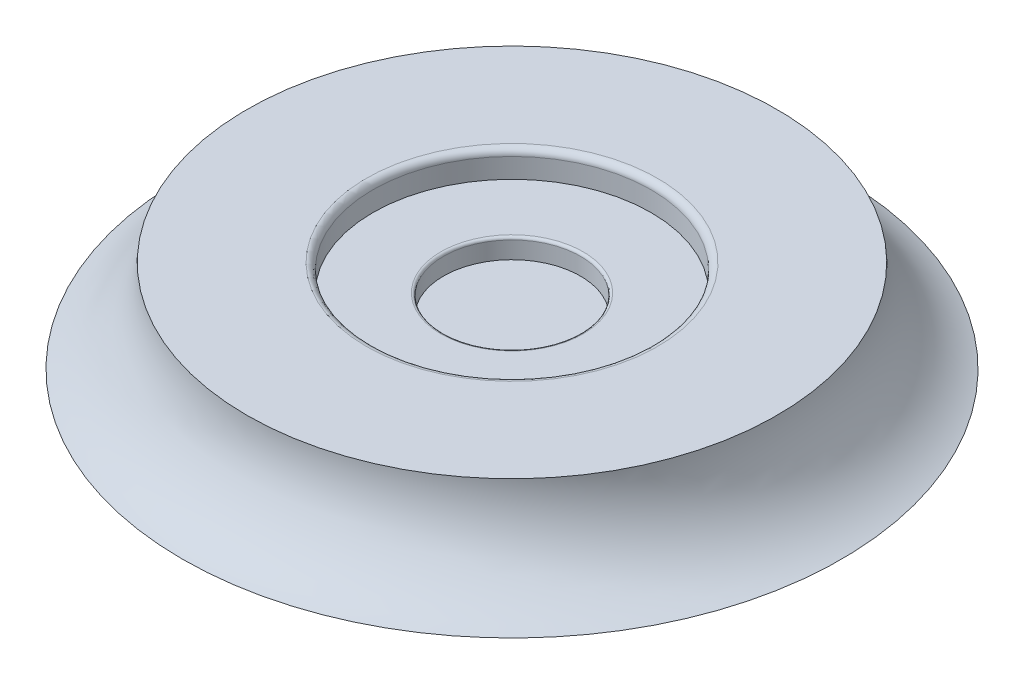
ISO-10303-21;
HEADER;
FILE_DESCRIPTION(('STEP AP214'),'2;1');
FILE_NAME('part.step','',(''),(''),'','','');
FILE_SCHEMA(('AUTOMOTIVE_DESIGN { 1 0 10303 214 1 1 1 1 }'));
ENDSEC;
DATA;
#1=APPLICATION_CONTEXT('core data for automotive mechanical design processes');
#2=APPLICATION_PROTOCOL_DEFINITION('international standard','automotive_design',2000,#1);
#3=PRODUCT_CONTEXT('',#1,'mechanical');
#4=PRODUCT('Part','Part','',(#3));
#5=PRODUCT_RELATED_PRODUCT_CATEGORY('part','',(#4));
#6=PRODUCT_DEFINITION_FORMATION('','',#4);
#7=PRODUCT_DEFINITION_CONTEXT('part definition',#1,'design');
#8=PRODUCT_DEFINITION('design','',#6,#7);
#9=PRODUCT_DEFINITION_SHAPE('','',#8);
#10=(LENGTH_UNIT() NAMED_UNIT(*) SI_UNIT(.MILLI.,.METRE.));
#11=(NAMED_UNIT(*) PLANE_ANGLE_UNIT() SI_UNIT($,.RADIAN.));
#12=(NAMED_UNIT(*) SI_UNIT($,.STERADIAN.) SOLID_ANGLE_UNIT());
#13=UNCERTAINTY_MEASURE_WITH_UNIT(LENGTH_MEASURE(1.E-05),#10,'distance_accuracy_value','');
#14=(GEOMETRIC_REPRESENTATION_CONTEXT(3) GLOBAL_UNCERTAINTY_ASSIGNED_CONTEXT((#13)) GLOBAL_UNIT_ASSIGNED_CONTEXT((#10,
#11,#12)) REPRESENTATION_CONTEXT('',''));
#15=CARTESIAN_POINT('',(0.,0.,0.));
#16=DIRECTION('',(0.,0.,1.));
#17=DIRECTION('',(1.,0.,0.));
#18=AXIS2_PLACEMENT_3D('',#15,#16,#17);
#19=CARTESIAN_POINT('',(0.,0.,0.));
#20=DIRECTION('',(0.,-1.,0.));
#21=DIRECTION('',(0.,0.,-1.));
#22=AXIS2_PLACEMENT_3D('',#19,#20,#21);
#23=PLANE('',#22);
#24=CARTESIAN_POINT('',(0.,0.,0.));
#25=DIRECTION('',(0.,1.,0.));
#26=DIRECTION('',(0.,0.,1.));
#27=AXIS2_PLACEMENT_3D('',#24,#25,#26);
#28=CIRCLE('',#27,25.);
#29=CARTESIAN_POINT('',(0.,0.,25.));
#30=VERTEX_POINT('',#29);
#31=EDGE_CURVE('E58',#30,#30,#28,.T.);
#32=ORIENTED_EDGE('',*,*,#31,.F.);
#33=EDGE_LOOP('',(#32));
#34=FACE_BOUND('',#33,.T.);
#35=ADVANCED_FACE('F38',(#34),#23,.T.);
#36=CARTESIAN_POINT('',(0.,6.99999999999999,0.));
#37=DIRECTION('',(0.,1.,0.));
#38=DIRECTION('',(0.,0.,1.));
#39=AXIS2_PLACEMENT_3D('',#36,#37,#38);
#40=TOROIDAL_SURFACE('',#39,27.5538669192307,7.4513244622108);
#41=ORIENTED_EDGE('',*,*,#31,.T.);
#42=EDGE_LOOP('',(#41));
#43=FACE_BOUND('',#42,.T.);
#44=CARTESIAN_POINT('',(0.,7.,0.));
#45=DIRECTION('',(0.,1.,0.));
#46=DIRECTION('',(0.,0.,1.));
#47=AXIS2_PLACEMENT_3D('',#44,#45,#46);
#48=CIRCLE('',#47,20.1025424570199);
#49=CARTESIAN_POINT('',(0.,7.,20.1025424570199));
#50=VERTEX_POINT('',#49);
#51=EDGE_CURVE('E61',#50,#50,#48,.T.);
#52=ORIENTED_EDGE('',*,*,#51,.F.);
#53=EDGE_LOOP('',(#52));
#54=FACE_BOUND('',#53,.T.);
#55=ADVANCED_FACE('F86',(#43,#54),#40,.F.);
#56=CARTESIAN_POINT('',(0.,7.,10.55));
#57=DIRECTION('',(0.,1.,0.));
#58=DIRECTION('',(0.,0.,1.));
#59=AXIS2_PLACEMENT_3D('',#56,#57,#58);
#60=PLANE('',#59);
#61=CARTESIAN_POINT('',(0.,7.,0.));
#62=DIRECTION('',(0.,1.,0.));
#63=DIRECTION('',(0.,0.,1.));
#64=AXIS2_PLACEMENT_3D('',#61,#62,#63);
#65=CIRCLE('',#64,11.05);
#66=CARTESIAN_POINT('',(0.,7.,11.05));
#67=VERTEX_POINT('',#66);
#68=EDGE_CURVE('E49',#67,#67,#65,.F.);
#69=ORIENTED_EDGE('',*,*,#68,.T.);
#70=EDGE_LOOP('',(#69));
#71=FACE_BOUND('',#70,.T.);
#72=ORIENTED_EDGE('',*,*,#51,.T.);
#73=EDGE_LOOP('',(#72));
#74=FACE_BOUND('',#73,.T.);
#75=ADVANCED_FACE('F92',(#71,#74),#60,.T.);
#76=CARTESIAN_POINT('',(0.,5.,0.));
#77=DIRECTION('',(0.,1.,0.));
#78=DIRECTION('',(0.,0.,1.));
#79=AXIS2_PLACEMENT_3D('',#76,#77,#78);
#80=CYLINDRICAL_SURFACE('',#79,10.55);
#81=CARTESIAN_POINT('',(0.,6.5,0.));
#82=DIRECTION('',(0.,1.,0.));
#83=DIRECTION('',(0.,0.,1.));
#84=AXIS2_PLACEMENT_3D('',#81,#82,#83);
#85=CIRCLE('',#84,10.55);
#86=CARTESIAN_POINT('',(0.,6.5,10.55));
#87=VERTEX_POINT('',#86);
#88=EDGE_CURVE('E53',#87,#87,#85,.T.);
#89=ORIENTED_EDGE('',*,*,#88,.T.);
#90=EDGE_LOOP('',(#89));
#91=FACE_BOUND('',#90,.T.);
#92=CARTESIAN_POINT('',(0.,5.,0.));
#93=DIRECTION('',(0.,1.,0.));
#94=DIRECTION('',(0.,0.,1.));
#95=AXIS2_PLACEMENT_3D('',#92,#93,#94);
#96=CIRCLE('',#95,10.55);
#97=CARTESIAN_POINT('',(0.,5.,10.55));
#98=VERTEX_POINT('',#97);
#99=EDGE_CURVE('E64',#98,#98,#96,.T.);
#100=ORIENTED_EDGE('',*,*,#99,.F.);
#101=EDGE_LOOP('',(#100));
#102=FACE_BOUND('',#101,.T.);
#103=ADVANCED_FACE('F99',(#91,#102),#80,.F.);
#104=CARTESIAN_POINT('',(0.,5.,10.55));
#105=DIRECTION('',(0.,1.,0.));
#106=DIRECTION('',(0.,0.,1.));
#107=AXIS2_PLACEMENT_3D('',#104,#105,#106);
#108=PLANE('',#107);
#109=CARTESIAN_POINT('',(0.,5.,0.));
#110=DIRECTION('',(0.,1.,0.));
#111=DIRECTION('',(0.,0.,1.));
#112=AXIS2_PLACEMENT_3D('',#109,#110,#111);
#113=CIRCLE('',#112,5.4);
#114=CARTESIAN_POINT('',(0.,5.,5.4));
#115=VERTEX_POINT('',#114);
#116=EDGE_CURVE('E10',#115,#115,#113,.F.);
#117=ORIENTED_EDGE('',*,*,#116,.T.);
#118=EDGE_LOOP('',(#117));
#119=FACE_BOUND('',#118,.T.);
#120=ORIENTED_EDGE('',*,*,#99,.T.);
#121=EDGE_LOOP('',(#120));
#122=FACE_BOUND('',#121,.T.);
#123=ADVANCED_FACE('F82',(#119,#122),#108,.T.);
#124=CARTESIAN_POINT('',(0.,6.5,0.));
#125=DIRECTION('',(0.,1.,0.));
#126=DIRECTION('',(0.,0.,1.));
#127=AXIS2_PLACEMENT_3D('',#124,#125,#126);
#128=TOROIDAL_SURFACE('',#127,11.05,0.5);
#129=ORIENTED_EDGE('',*,*,#68,.F.);
#130=EDGE_LOOP('',(#129));
#131=FACE_BOUND('',#130,.T.);
#132=ORIENTED_EDGE('',*,*,#88,.F.);
#133=EDGE_LOOP('',(#132));
#134=FACE_BOUND('',#133,.T.);
#135=ADVANCED_FACE('F75',(#131,#134),#128,.T.);
#136=CARTESIAN_POINT('',(0.,3.5,0.));
#137=DIRECTION('',(0.,1.,0.));
#138=DIRECTION('',(0.,0.,1.));
#139=AXIS2_PLACEMENT_3D('',#136,#137,#138);
#140=CYLINDRICAL_SURFACE('',#139,5.2);
#141=CARTESIAN_POINT('',(0.,4.8,0.));
#142=DIRECTION('',(0.,1.,0.));
#143=DIRECTION('',(0.,0.,1.));
#144=AXIS2_PLACEMENT_3D('',#141,#142,#143);
#145=CIRCLE('',#144,5.2);
#146=CARTESIAN_POINT('',(0.,4.8,5.2));
#147=VERTEX_POINT('',#146);
#148=EDGE_CURVE('E45',#147,#147,#145,.T.);
#149=ORIENTED_EDGE('',*,*,#148,.T.);
#150=EDGE_LOOP('',(#149));
#151=FACE_BOUND('',#150,.T.);
#152=CARTESIAN_POINT('',(0.,3.5,0.));
#153=DIRECTION('',(0.,1.,0.));
#154=DIRECTION('',(0.,0.,1.));
#155=AXIS2_PLACEMENT_3D('',#152,#153,#154);
#156=CIRCLE('',#155,5.2);
#157=CARTESIAN_POINT('',(0.,3.5,5.2));
#158=VERTEX_POINT('',#157);
#159=EDGE_CURVE('E67',#158,#158,#156,.T.);
#160=ORIENTED_EDGE('',*,*,#159,.F.);
#161=EDGE_LOOP('',(#160));
#162=FACE_BOUND('',#161,.T.);
#163=ADVANCED_FACE('F73',(#151,#162),#140,.F.);
#164=CARTESIAN_POINT('',(0.,3.5,0.));
#165=DIRECTION('',(0.,1.,0.));
#166=DIRECTION('',(0.,0.,1.));
#167=AXIS2_PLACEMENT_3D('',#164,#165,#166);
#168=PLANE('',#167);
#169=ORIENTED_EDGE('',*,*,#159,.T.);
#170=EDGE_LOOP('',(#169));
#171=FACE_BOUND('',#170,.T.);
#172=ADVANCED_FACE('F71',(#171),#168,.T.);
#173=CARTESIAN_POINT('',(0.,4.8,0.));
#174=DIRECTION('',(0.,1.,0.));
#175=DIRECTION('',(0.,0.,1.));
#176=AXIS2_PLACEMENT_3D('',#173,#174,#175);
#177=TOROIDAL_SURFACE('',#176,5.4,0.2);
#178=ORIENTED_EDGE('',*,*,#116,.F.);
#179=EDGE_LOOP('',(#178));
#180=FACE_BOUND('',#179,.T.);
#181=ORIENTED_EDGE('',*,*,#148,.F.);
#182=EDGE_LOOP('',(#181));
#183=FACE_BOUND('',#182,.T.);
#184=ADVANCED_FACE('F40',(#180,#183),#177,.T.);
#185=CLOSED_SHELL('',(#35,#55,#75,#103,#123,#135,#163,#172,#184));
#186=MANIFOLD_SOLID_BREP('B2',#185);
#187=ADVANCED_BREP_SHAPE_REPRESENTATION('',(#18,#186),#14);
#188=SHAPE_DEFINITION_REPRESENTATION(#9,#187);
ENDSEC;
END-ISO-10303-21;
